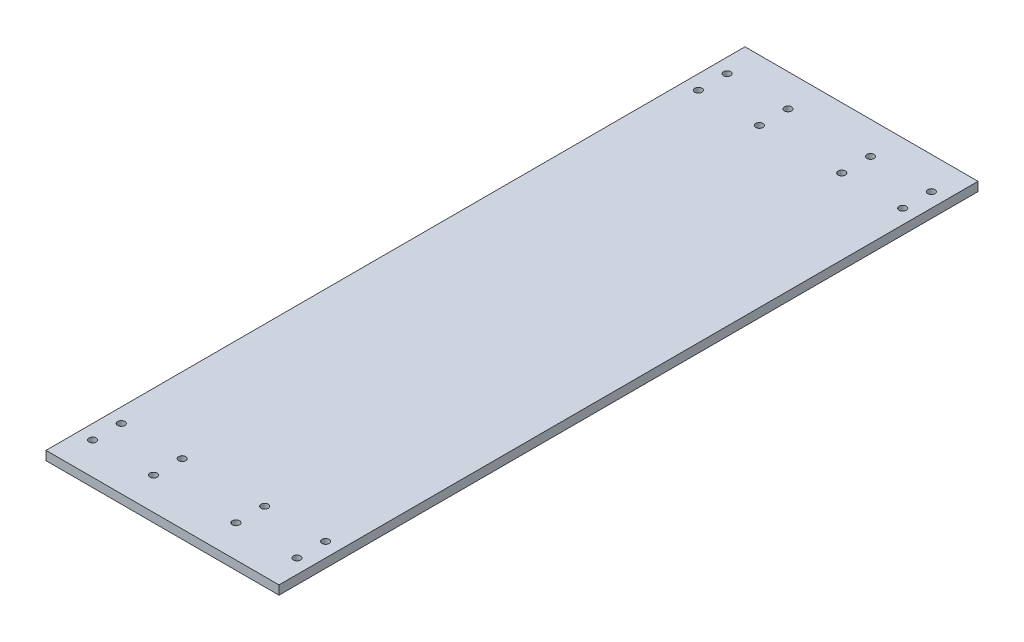
ISO-10303-21;
HEADER;
FILE_DESCRIPTION(('STEP AP214'),'2;1');
FILE_NAME('part.step','',(''),(''),'','','');
FILE_SCHEMA(('AUTOMOTIVE_DESIGN { 1 0 10303 214 1 1 1 1 }'));
ENDSEC;
DATA;
#1=APPLICATION_CONTEXT('core data for automotive mechanical design processes');
#2=APPLICATION_PROTOCOL_DEFINITION('international standard','automotive_design',2000,#1);
#3=PRODUCT_CONTEXT('',#1,'mechanical');
#4=PRODUCT('Part','Part','',(#3));
#5=PRODUCT_RELATED_PRODUCT_CATEGORY('part','',(#4));
#6=PRODUCT_DEFINITION_FORMATION('','',#4);
#7=PRODUCT_DEFINITION_CONTEXT('part definition',#1,'design');
#8=PRODUCT_DEFINITION('design','',#6,#7);
#9=PRODUCT_DEFINITION_SHAPE('','',#8);
#10=(LENGTH_UNIT() NAMED_UNIT(*) SI_UNIT(.MILLI.,.METRE.));
#11=(NAMED_UNIT(*) PLANE_ANGLE_UNIT() SI_UNIT($,.RADIAN.));
#12=(NAMED_UNIT(*) SI_UNIT($,.STERADIAN.) SOLID_ANGLE_UNIT());
#13=UNCERTAINTY_MEASURE_WITH_UNIT(LENGTH_MEASURE(1.E-05),#10,'distance_accuracy_value','');
#14=(GEOMETRIC_REPRESENTATION_CONTEXT(3) GLOBAL_UNCERTAINTY_ASSIGNED_CONTEXT((#13)) GLOBAL_UNIT_ASSIGNED_CONTEXT((#10,
#11,#12)) REPRESENTATION_CONTEXT('',''));
#15=CARTESIAN_POINT('',(0.,0.,0.));
#16=DIRECTION('',(0.,0.,1.));
#17=DIRECTION('',(1.,0.,0.));
#18=AXIS2_PLACEMENT_3D('',#15,#16,#17);
#19=CARTESIAN_POINT('',(65.,5.,195.));
#20=DIRECTION('',(-1.,0.,0.));
#21=DIRECTION('',(0.,0.,1.));
#22=AXIS2_PLACEMENT_3D('',#19,#20,#21);
#23=PLANE('',#22);
#24=DIRECTION('',(0.,0.,-1.));
#25=VECTOR('',#24,1.);
#26=CARTESIAN_POINT('',(65.,0.,195.));
#27=LINE('',#26,#25);
#28=CARTESIAN_POINT('',(65.,0.,195.));
#29=VERTEX_POINT('',#28);
#30=CARTESIAN_POINT('',(65.,0.,-195.));
#31=VERTEX_POINT('',#30);
#32=EDGE_CURVE('E99',#29,#31,#27,.T.);
#33=ORIENTED_EDGE('',*,*,#32,.T.);
#34=DIRECTION('',(0.,-1.,0.));
#35=VECTOR('',#34,1.);
#36=CARTESIAN_POINT('',(65.,5.,-195.));
#37=LINE('',#36,#35);
#38=CARTESIAN_POINT('',(65.,5.,-195.));
#39=VERTEX_POINT('',#38);
#40=EDGE_CURVE('E11',#39,#31,#37,.T.);
#41=ORIENTED_EDGE('',*,*,#40,.F.);
#42=DIRECTION('',(0.,0.,-1.));
#43=VECTOR('',#42,1.);
#44=CARTESIAN_POINT('',(65.,5.,195.));
#45=LINE('',#44,#43);
#46=CARTESIAN_POINT('',(65.,5.,195.));
#47=VERTEX_POINT('',#46);
#48=EDGE_CURVE('E86',#47,#39,#45,.T.);
#49=ORIENTED_EDGE('',*,*,#48,.F.);
#50=DIRECTION('',(0.,-1.,0.));
#51=VECTOR('',#50,1.);
#52=CARTESIAN_POINT('',(65.,5.,195.));
#53=LINE('',#52,#51);
#54=EDGE_CURVE('E95',#47,#29,#53,.T.);
#55=ORIENTED_EDGE('',*,*,#54,.T.);
#56=EDGE_LOOP('',(#33,#41,#49,#55));
#57=FACE_BOUND('',#56,.T.);
#58=ADVANCED_FACE('F33',(#57),#23,.F.);
#59=CARTESIAN_POINT('',(-65.,5.,-195.));
#60=DIRECTION('',(0.,0.,1.));
#61=DIRECTION('',(1.,0.,0.));
#62=AXIS2_PLACEMENT_3D('',#59,#60,#61);
#63=PLANE('',#62);
#64=DIRECTION('',(-1.,0.,0.));
#65=VECTOR('',#64,1.);
#66=CARTESIAN_POINT('',(-65.,0.,-195.));
#67=LINE('',#66,#65);
#68=CARTESIAN_POINT('',(-65.,0.,-195.));
#69=VERTEX_POINT('',#68);
#70=EDGE_CURVE('E90',#31,#69,#67,.T.);
#71=ORIENTED_EDGE('',*,*,#70,.T.);
#72=DIRECTION('',(0.,-1.,0.));
#73=VECTOR('',#72,1.);
#74=CARTESIAN_POINT('',(-65.,5.,-195.));
#75=LINE('',#74,#73);
#76=CARTESIAN_POINT('',(-65.,5.,-195.));
#77=VERTEX_POINT('',#76);
#78=EDGE_CURVE('E42',#77,#69,#75,.T.);
#79=ORIENTED_EDGE('',*,*,#78,.F.);
#80=DIRECTION('',(-1.,0.,0.));
#81=VECTOR('',#80,1.);
#82=CARTESIAN_POINT('',(-65.,5.,-195.));
#83=LINE('',#82,#81);
#84=EDGE_CURVE('E81',#39,#77,#83,.T.);
#85=ORIENTED_EDGE('',*,*,#84,.F.);
#86=ORIENTED_EDGE('',*,*,#40,.T.);
#87=EDGE_LOOP('',(#71,#79,#85,#86));
#88=FACE_BOUND('',#87,.T.);
#89=ADVANCED_FACE('F89',(#88),#63,.F.);
#90=CARTESIAN_POINT('',(-65.,5.,195.));
#91=DIRECTION('',(1.,0.,0.));
#92=DIRECTION('',(0.,0.,-1.));
#93=AXIS2_PLACEMENT_3D('',#90,#91,#92);
#94=PLANE('',#93);
#95=DIRECTION('',(0.,0.,1.));
#96=VECTOR('',#95,1.);
#97=CARTESIAN_POINT('',(-65.,0.,195.));
#98=LINE('',#97,#96);
#99=CARTESIAN_POINT('',(-65.,0.,195.));
#100=VERTEX_POINT('',#99);
#101=EDGE_CURVE('E68',#69,#100,#98,.T.);
#102=ORIENTED_EDGE('',*,*,#101,.T.);
#103=DIRECTION('',(0.,-1.,0.));
#104=VECTOR('',#103,1.);
#105=CARTESIAN_POINT('',(-65.,5.,195.));
#106=LINE('',#105,#104);
#107=CARTESIAN_POINT('',(-65.,5.,195.));
#108=VERTEX_POINT('',#107);
#109=EDGE_CURVE('E91',#108,#100,#106,.T.);
#110=ORIENTED_EDGE('',*,*,#109,.F.);
#111=DIRECTION('',(0.,0.,1.));
#112=VECTOR('',#111,1.);
#113=CARTESIAN_POINT('',(-65.,5.,195.));
#114=LINE('',#113,#112);
#115=EDGE_CURVE('E84',#77,#108,#114,.T.);
#116=ORIENTED_EDGE('',*,*,#115,.F.);
#117=ORIENTED_EDGE('',*,*,#78,.T.);
#118=EDGE_LOOP('',(#102,#110,#116,#117));
#119=FACE_BOUND('',#118,.T.);
#120=ADVANCED_FACE('F93',(#119),#94,.F.);
#121=CARTESIAN_POINT('',(-65.,5.,195.));
#122=DIRECTION('',(0.,0.,-1.));
#123=DIRECTION('',(-1.,0.,0.));
#124=AXIS2_PLACEMENT_3D('',#121,#122,#123);
#125=PLANE('',#124);
#126=DIRECTION('',(1.,0.,0.));
#127=VECTOR('',#126,1.);
#128=CARTESIAN_POINT('',(-65.,0.,195.));
#129=LINE('',#128,#127);
#130=EDGE_CURVE('E74',#100,#29,#129,.T.);
#131=ORIENTED_EDGE('',*,*,#130,.T.);
#132=ORIENTED_EDGE('',*,*,#54,.F.);
#133=DIRECTION('',(1.,0.,0.));
#134=VECTOR('',#133,1.);
#135=CARTESIAN_POINT('',(-65.,5.,195.));
#136=LINE('',#135,#134);
#137=EDGE_CURVE('E51',#108,#47,#136,.T.);
#138=ORIENTED_EDGE('',*,*,#137,.F.);
#139=ORIENTED_EDGE('',*,*,#109,.T.);
#140=EDGE_LOOP('',(#131,#132,#138,#139));
#141=FACE_BOUND('',#140,.T.);
#142=ADVANCED_FACE('F202',(#141),#125,.F.);
#143=CARTESIAN_POINT('',(0.,5.,0.));
#144=DIRECTION('',(0.,-1.,0.));
#145=DIRECTION('',(0.,0.,-1.));
#146=AXIS2_PLACEMENT_3D('',#143,#144,#145);
#147=PLANE('',#146);
#148=CARTESIAN_POINT('',(57.,5.,161.));
#149=DIRECTION('',(0.,1.,0.));
#150=DIRECTION('',(0.,0.,-1.));
#151=AXIS2_PLACEMENT_3D('',#148,#149,#150);
#152=CIRCLE('',#151,2.);
#153=CARTESIAN_POINT('',(57.,5.,159.));
#154=VERTEX_POINT('',#153);
#155=EDGE_CURVE('E404',#154,#154,#152,.T.);
#156=ORIENTED_EDGE('',*,*,#155,.F.);
#157=EDGE_LOOP('',(#156));
#158=FACE_BOUND('',#157,.T.);
#159=CARTESIAN_POINT('',(23.,5.,177.));
#160=DIRECTION('',(0.,1.,0.));
#161=DIRECTION('',(0.,0.,-1.));
#162=AXIS2_PLACEMENT_3D('',#159,#160,#161);
#163=CIRCLE('',#162,2.);
#164=CARTESIAN_POINT('',(23.,5.,175.));
#165=VERTEX_POINT('',#164);
#166=EDGE_CURVE('E405',#165,#165,#163,.T.);
#167=ORIENTED_EDGE('',*,*,#166,.F.);
#168=EDGE_LOOP('',(#167));
#169=FACE_BOUND('',#168,.T.);
#170=CARTESIAN_POINT('',(23.,5.,161.));
#171=DIRECTION('',(0.,1.,0.));
#172=DIRECTION('',(0.,0.,-1.));
#173=AXIS2_PLACEMENT_3D('',#170,#171,#172);
#174=CIRCLE('',#173,2.);
#175=CARTESIAN_POINT('',(23.,5.,159.));
#176=VERTEX_POINT('',#175);
#177=EDGE_CURVE('E409',#176,#176,#174,.T.);
#178=ORIENTED_EDGE('',*,*,#177,.F.);
#179=EDGE_LOOP('',(#178));
#180=FACE_BOUND('',#179,.T.);
#181=CARTESIAN_POINT('',(57.,5.,177.));
#182=DIRECTION('',(0.,1.,0.));
#183=DIRECTION('',(0.,0.,-1.));
#184=AXIS2_PLACEMENT_3D('',#181,#182,#183);
#185=CIRCLE('',#184,2.);
#186=CARTESIAN_POINT('',(57.,5.,175.));
#187=VERTEX_POINT('',#186);
#188=EDGE_CURVE('E152',#187,#187,#185,.T.);
#189=ORIENTED_EDGE('',*,*,#188,.F.);
#190=EDGE_LOOP('',(#189));
#191=FACE_BOUND('',#190,.T.);
#192=CARTESIAN_POINT('',(-57.,5.,161.));
#193=DIRECTION('',(0.,-1.,0.));
#194=DIRECTION('',(0.,0.,-1.));
#195=AXIS2_PLACEMENT_3D('',#192,#193,#194);
#196=CIRCLE('',#195,2.);
#197=CARTESIAN_POINT('',(-57.,5.,159.));
#198=VERTEX_POINT('',#197);
#199=EDGE_CURVE('E168',#198,#198,#196,.T.);
#200=ORIENTED_EDGE('',*,*,#199,.T.);
#201=EDGE_LOOP('',(#200));
#202=FACE_BOUND('',#201,.T.);
#203=CARTESIAN_POINT('',(-23.,5.,177.));
#204=DIRECTION('',(0.,-1.,0.));
#205=DIRECTION('',(0.,0.,-1.));
#206=AXIS2_PLACEMENT_3D('',#203,#204,#205);
#207=CIRCLE('',#206,2.);
#208=CARTESIAN_POINT('',(-23.,5.,175.));
#209=VERTEX_POINT('',#208);
#210=EDGE_CURVE('E163',#209,#209,#207,.T.);
#211=ORIENTED_EDGE('',*,*,#210,.T.);
#212=EDGE_LOOP('',(#211));
#213=FACE_BOUND('',#212,.T.);
#214=CARTESIAN_POINT('',(-23.,5.,161.));
#215=DIRECTION('',(0.,-1.,0.));
#216=DIRECTION('',(0.,0.,-1.));
#217=AXIS2_PLACEMENT_3D('',#214,#215,#216);
#218=CIRCLE('',#217,2.);
#219=CARTESIAN_POINT('',(-23.,5.,159.));
#220=VERTEX_POINT('',#219);
#221=EDGE_CURVE('E159',#220,#220,#218,.T.);
#222=ORIENTED_EDGE('',*,*,#221,.T.);
#223=EDGE_LOOP('',(#222));
#224=FACE_BOUND('',#223,.T.);
#225=CARTESIAN_POINT('',(-57.,5.,177.));
#226=DIRECTION('',(0.,-1.,0.));
#227=DIRECTION('',(0.,0.,-1.));
#228=AXIS2_PLACEMENT_3D('',#225,#226,#227);
#229=CIRCLE('',#228,2.);
#230=CARTESIAN_POINT('',(-57.,5.,175.));
#231=VERTEX_POINT('',#230);
#232=EDGE_CURVE('E138',#231,#231,#229,.T.);
#233=ORIENTED_EDGE('',*,*,#232,.T.);
#234=EDGE_LOOP('',(#233));
#235=FACE_BOUND('',#234,.T.);
#236=CARTESIAN_POINT('',(57.,5.,-161.));
#237=DIRECTION('',(0.,-1.,0.));
#238=DIRECTION('',(0.,0.,1.));
#239=AXIS2_PLACEMENT_3D('',#236,#237,#238);
#240=CIRCLE('',#239,2.);
#241=CARTESIAN_POINT('',(57.,5.,-159.));
#242=VERTEX_POINT('',#241);
#243=EDGE_CURVE('E180',#242,#242,#240,.T.);
#244=ORIENTED_EDGE('',*,*,#243,.T.);
#245=EDGE_LOOP('',(#244));
#246=FACE_BOUND('',#245,.T.);
#247=CARTESIAN_POINT('',(23.,5.,-177.));
#248=DIRECTION('',(0.,-1.,0.));
#249=DIRECTION('',(0.,0.,1.));
#250=AXIS2_PLACEMENT_3D('',#247,#248,#249);
#251=CIRCLE('',#250,2.);
#252=CARTESIAN_POINT('',(23.,5.,-175.));
#253=VERTEX_POINT('',#252);
#254=EDGE_CURVE('E179',#253,#253,#251,.T.);
#255=ORIENTED_EDGE('',*,*,#254,.T.);
#256=EDGE_LOOP('',(#255));
#257=FACE_BOUND('',#256,.T.);
#258=CARTESIAN_POINT('',(23.,5.,-161.));
#259=DIRECTION('',(0.,-1.,0.));
#260=DIRECTION('',(0.,0.,1.));
#261=AXIS2_PLACEMENT_3D('',#258,#259,#260);
#262=CIRCLE('',#261,2.);
#263=CARTESIAN_POINT('',(23.,5.,-159.));
#264=VERTEX_POINT('',#263);
#265=EDGE_CURVE('E147',#264,#264,#262,.T.);
#266=ORIENTED_EDGE('',*,*,#265,.T.);
#267=EDGE_LOOP('',(#266));
#268=FACE_BOUND('',#267,.T.);
#269=CARTESIAN_POINT('',(57.,5.,-177.));
#270=DIRECTION('',(0.,-1.,0.));
#271=DIRECTION('',(0.,0.,1.));
#272=AXIS2_PLACEMENT_3D('',#269,#270,#271);
#273=CIRCLE('',#272,2.);
#274=CARTESIAN_POINT('',(57.,5.,-175.));
#275=VERTEX_POINT('',#274);
#276=EDGE_CURVE('E124',#275,#275,#273,.T.);
#277=ORIENTED_EDGE('',*,*,#276,.T.);
#278=EDGE_LOOP('',(#277));
#279=FACE_BOUND('',#278,.T.);
#280=CARTESIAN_POINT('',(-57.,5.,-161.));
#281=DIRECTION('',(0.,1.,0.));
#282=DIRECTION('',(0.,0.,1.));
#283=AXIS2_PLACEMENT_3D('',#280,#281,#282);
#284=CIRCLE('',#283,2.);
#285=CARTESIAN_POINT('',(-57.,5.,-159.));
#286=VERTEX_POINT('',#285);
#287=EDGE_CURVE('E190',#286,#286,#284,.T.);
#288=ORIENTED_EDGE('',*,*,#287,.F.);
#289=EDGE_LOOP('',(#288));
#290=FACE_BOUND('',#289,.T.);
#291=CARTESIAN_POINT('',(-23.,5.,-177.));
#292=DIRECTION('',(0.,1.,0.));
#293=DIRECTION('',(0.,0.,1.));
#294=AXIS2_PLACEMENT_3D('',#291,#292,#293);
#295=CIRCLE('',#294,2.);
#296=CARTESIAN_POINT('',(-23.,5.,-175.));
#297=VERTEX_POINT('',#296);
#298=EDGE_CURVE('E189',#297,#297,#295,.T.);
#299=ORIENTED_EDGE('',*,*,#298,.F.);
#300=EDGE_LOOP('',(#299));
#301=FACE_BOUND('',#300,.T.);
#302=CARTESIAN_POINT('',(-23.,5.,-161.));
#303=DIRECTION('',(0.,1.,0.));
#304=DIRECTION('',(0.,0.,1.));
#305=AXIS2_PLACEMENT_3D('',#302,#303,#304);
#306=CIRCLE('',#305,2.);
#307=CARTESIAN_POINT('',(-23.,5.,-159.));
#308=VERTEX_POINT('',#307);
#309=EDGE_CURVE('E133',#308,#308,#306,.T.);
#310=ORIENTED_EDGE('',*,*,#309,.F.);
#311=EDGE_LOOP('',(#310));
#312=FACE_BOUND('',#311,.T.);
#313=CARTESIAN_POINT('',(-57.,5.,-177.));
#314=DIRECTION('',(0.,1.,0.));
#315=DIRECTION('',(0.,0.,1.));
#316=AXIS2_PLACEMENT_3D('',#313,#314,#315);
#317=CIRCLE('',#316,2.);
#318=CARTESIAN_POINT('',(-57.,5.,-175.));
#319=VERTEX_POINT('',#318);
#320=EDGE_CURVE('E112',#319,#319,#317,.T.);
#321=ORIENTED_EDGE('',*,*,#320,.F.);
#322=EDGE_LOOP('',(#321));
#323=FACE_BOUND('',#322,.T.);
#324=ORIENTED_EDGE('',*,*,#48,.T.);
#325=ORIENTED_EDGE('',*,*,#84,.T.);
#326=ORIENTED_EDGE('',*,*,#115,.T.);
#327=ORIENTED_EDGE('',*,*,#137,.T.);
#328=EDGE_LOOP('',(#324,#325,#326,#327));
#329=FACE_BOUND('',#328,.T.);
#330=ADVANCED_FACE('F82',(#158,#169,#180,#191,#202,#213,#224,#235,#246,#257,#268,#279,#290,#301,
#312,#323,#329),#147,.F.);
#331=CARTESIAN_POINT('',(0.,0.,0.));
#332=DIRECTION('',(0.,-1.,0.));
#333=DIRECTION('',(0.,0.,-1.));
#334=AXIS2_PLACEMENT_3D('',#331,#332,#333);
#335=PLANE('',#334);
#336=CARTESIAN_POINT('',(57.,0.,161.));
#337=DIRECTION('',(0.,-1.,0.));
#338=DIRECTION('',(0.,0.,-1.));
#339=AXIS2_PLACEMENT_3D('',#336,#337,#338);
#340=CIRCLE('',#339,2.);
#341=CARTESIAN_POINT('',(57.,0.,159.));
#342=VERTEX_POINT('',#341);
#343=EDGE_CURVE('E36',#342,#342,#340,.T.);
#344=ORIENTED_EDGE('',*,*,#343,.F.);
#345=EDGE_LOOP('',(#344));
#346=FACE_BOUND('',#345,.T.);
#347=CARTESIAN_POINT('',(23.,0.,177.));
#348=DIRECTION('',(0.,-1.,0.));
#349=DIRECTION('',(0.,0.,-1.));
#350=AXIS2_PLACEMENT_3D('',#347,#348,#349);
#351=CIRCLE('',#350,2.);
#352=CARTESIAN_POINT('',(23.,0.,175.));
#353=VERTEX_POINT('',#352);
#354=EDGE_CURVE('E154',#353,#353,#351,.T.);
#355=ORIENTED_EDGE('',*,*,#354,.F.);
#356=EDGE_LOOP('',(#355));
#357=FACE_BOUND('',#356,.T.);
#358=CARTESIAN_POINT('',(23.,0.,161.));
#359=DIRECTION('',(0.,-1.,0.));
#360=DIRECTION('',(0.,0.,-1.));
#361=AXIS2_PLACEMENT_3D('',#358,#359,#360);
#362=CIRCLE('',#361,2.);
#363=CARTESIAN_POINT('',(23.,0.,159.));
#364=VERTEX_POINT('',#363);
#365=EDGE_CURVE('E151',#364,#364,#362,.T.);
#366=ORIENTED_EDGE('',*,*,#365,.F.);
#367=EDGE_LOOP('',(#366));
#368=FACE_BOUND('',#367,.T.);
#369=CARTESIAN_POINT('',(57.,0.,177.));
#370=DIRECTION('',(0.,-1.,0.));
#371=DIRECTION('',(0.,0.,-1.));
#372=AXIS2_PLACEMENT_3D('',#369,#370,#371);
#373=CIRCLE('',#372,2.);
#374=CARTESIAN_POINT('',(57.,0.,175.));
#375=VERTEX_POINT('',#374);
#376=EDGE_CURVE('E148',#375,#375,#373,.T.);
#377=ORIENTED_EDGE('',*,*,#376,.F.);
#378=EDGE_LOOP('',(#377));
#379=FACE_BOUND('',#378,.T.);
#380=CARTESIAN_POINT('',(-57.,0.,161.));
#381=DIRECTION('',(0.,-1.,0.));
#382=DIRECTION('',(0.,0.,-1.));
#383=AXIS2_PLACEMENT_3D('',#380,#381,#382);
#384=CIRCLE('',#383,2.);
#385=CARTESIAN_POINT('',(-57.,0.,159.));
#386=VERTEX_POINT('',#385);
#387=EDGE_CURVE('E144',#386,#386,#384,.F.);
#388=ORIENTED_EDGE('',*,*,#387,.T.);
#389=EDGE_LOOP('',(#388));
#390=FACE_BOUND('',#389,.T.);
#391=CARTESIAN_POINT('',(-23.,0.,177.));
#392=DIRECTION('',(0.,-1.,0.));
#393=DIRECTION('',(0.,0.,-1.));
#394=AXIS2_PLACEMENT_3D('',#391,#392,#393);
#395=CIRCLE('',#394,2.);
#396=CARTESIAN_POINT('',(-23.,0.,175.));
#397=VERTEX_POINT('',#396);
#398=EDGE_CURVE('E141',#397,#397,#395,.F.);
#399=ORIENTED_EDGE('',*,*,#398,.T.);
#400=EDGE_LOOP('',(#399));
#401=FACE_BOUND('',#400,.T.);
#402=CARTESIAN_POINT('',(-23.,0.,161.));
#403=DIRECTION('',(0.,-1.,0.));
#404=DIRECTION('',(0.,0.,-1.));
#405=AXIS2_PLACEMENT_3D('',#402,#403,#404);
#406=CIRCLE('',#405,2.);
#407=CARTESIAN_POINT('',(-23.,0.,159.));
#408=VERTEX_POINT('',#407);
#409=EDGE_CURVE('E137',#408,#408,#406,.F.);
#410=ORIENTED_EDGE('',*,*,#409,.T.);
#411=EDGE_LOOP('',(#410));
#412=FACE_BOUND('',#411,.T.);
#413=CARTESIAN_POINT('',(-57.,0.,177.));
#414=DIRECTION('',(0.,-1.,0.));
#415=DIRECTION('',(0.,0.,-1.));
#416=AXIS2_PLACEMENT_3D('',#413,#414,#415);
#417=CIRCLE('',#416,2.);
#418=CARTESIAN_POINT('',(-57.,0.,175.));
#419=VERTEX_POINT('',#418);
#420=EDGE_CURVE('E134',#419,#419,#417,.F.);
#421=ORIENTED_EDGE('',*,*,#420,.T.);
#422=EDGE_LOOP('',(#421));
#423=FACE_BOUND('',#422,.T.);
#424=CARTESIAN_POINT('',(57.,0.,-161.));
#425=DIRECTION('',(0.,-1.,0.));
#426=DIRECTION('',(0.,0.,-1.));
#427=AXIS2_PLACEMENT_3D('',#424,#425,#426);
#428=CIRCLE('',#427,2.);
#429=CARTESIAN_POINT('',(57.,0.,-163.));
#430=VERTEX_POINT('',#429);
#431=EDGE_CURVE('E130',#430,#430,#428,.F.);
#432=ORIENTED_EDGE('',*,*,#431,.T.);
#433=EDGE_LOOP('',(#432));
#434=FACE_BOUND('',#433,.T.);
#435=CARTESIAN_POINT('',(23.,0.,-177.));
#436=DIRECTION('',(0.,-1.,0.));
#437=DIRECTION('',(0.,0.,-1.));
#438=AXIS2_PLACEMENT_3D('',#435,#436,#437);
#439=CIRCLE('',#438,2.);
#440=CARTESIAN_POINT('',(23.,0.,-179.));
#441=VERTEX_POINT('',#440);
#442=EDGE_CURVE('E127',#441,#441,#439,.F.);
#443=ORIENTED_EDGE('',*,*,#442,.T.);
#444=EDGE_LOOP('',(#443));
#445=FACE_BOUND('',#444,.T.);
#446=CARTESIAN_POINT('',(23.,0.,-161.));
#447=DIRECTION('',(0.,-1.,0.));
#448=DIRECTION('',(0.,0.,-1.));
#449=AXIS2_PLACEMENT_3D('',#446,#447,#448);
#450=CIRCLE('',#449,2.);
#451=CARTESIAN_POINT('',(23.,0.,-163.));
#452=VERTEX_POINT('',#451);
#453=EDGE_CURVE('E123',#452,#452,#450,.F.);
#454=ORIENTED_EDGE('',*,*,#453,.T.);
#455=EDGE_LOOP('',(#454));
#456=FACE_BOUND('',#455,.T.);
#457=CARTESIAN_POINT('',(57.,0.,-177.));
#458=DIRECTION('',(0.,-1.,0.));
#459=DIRECTION('',(0.,0.,-1.));
#460=AXIS2_PLACEMENT_3D('',#457,#458,#459);
#461=CIRCLE('',#460,2.);
#462=CARTESIAN_POINT('',(57.,0.,-179.));
#463=VERTEX_POINT('',#462);
#464=EDGE_CURVE('E120',#463,#463,#461,.F.);
#465=ORIENTED_EDGE('',*,*,#464,.T.);
#466=EDGE_LOOP('',(#465));
#467=FACE_BOUND('',#466,.T.);
#468=CARTESIAN_POINT('',(-57.,0.,-161.));
#469=DIRECTION('',(0.,-1.,0.));
#470=DIRECTION('',(0.,0.,-1.));
#471=AXIS2_PLACEMENT_3D('',#468,#469,#470);
#472=CIRCLE('',#471,2.);
#473=CARTESIAN_POINT('',(-57.,0.,-163.));
#474=VERTEX_POINT('',#473);
#475=EDGE_CURVE('E102',#474,#474,#472,.T.);
#476=ORIENTED_EDGE('',*,*,#475,.F.);
#477=EDGE_LOOP('',(#476));
#478=FACE_BOUND('',#477,.T.);
#479=CARTESIAN_POINT('',(-23.,0.,-177.));
#480=DIRECTION('',(0.,-1.,0.));
#481=DIRECTION('',(0.,0.,-1.));
#482=AXIS2_PLACEMENT_3D('',#479,#480,#481);
#483=CIRCLE('',#482,2.);
#484=CARTESIAN_POINT('',(-23.,0.,-179.));
#485=VERTEX_POINT('',#484);
#486=EDGE_CURVE('E115',#485,#485,#483,.T.);
#487=ORIENTED_EDGE('',*,*,#486,.F.);
#488=EDGE_LOOP('',(#487));
#489=FACE_BOUND('',#488,.T.);
#490=CARTESIAN_POINT('',(-23.,0.,-161.));
#491=DIRECTION('',(0.,-1.,0.));
#492=DIRECTION('',(0.,0.,-1.));
#493=AXIS2_PLACEMENT_3D('',#490,#491,#492);
#494=CIRCLE('',#493,2.);
#495=CARTESIAN_POINT('',(-23.,0.,-163.));
#496=VERTEX_POINT('',#495);
#497=EDGE_CURVE('E111',#496,#496,#494,.T.);
#498=ORIENTED_EDGE('',*,*,#497,.F.);
#499=EDGE_LOOP('',(#498));
#500=FACE_BOUND('',#499,.T.);
#501=CARTESIAN_POINT('',(-57.,0.,-177.));
#502=DIRECTION('',(0.,-1.,0.));
#503=DIRECTION('',(0.,0.,-1.));
#504=AXIS2_PLACEMENT_3D('',#501,#502,#503);
#505=CIRCLE('',#504,2.);
#506=CARTESIAN_POINT('',(-57.,0.,-179.));
#507=VERTEX_POINT('',#506);
#508=EDGE_CURVE('E108',#507,#507,#505,.T.);
#509=ORIENTED_EDGE('',*,*,#508,.F.);
#510=EDGE_LOOP('',(#509));
#511=FACE_BOUND('',#510,.T.);
#512=ORIENTED_EDGE('',*,*,#32,.F.);
#513=ORIENTED_EDGE('',*,*,#130,.F.);
#514=ORIENTED_EDGE('',*,*,#101,.F.);
#515=ORIENTED_EDGE('',*,*,#70,.F.);
#516=EDGE_LOOP('',(#512,#513,#514,#515));
#517=FACE_BOUND('',#516,.T.);
#518=ADVANCED_FACE('F201',(#346,#357,#368,#379,#390,#401,#412,#423,#434,#445,#456,#467,#478,
#489,#500,#511,#517),#335,.T.);
#519=CARTESIAN_POINT('',(-57.,-5.,-177.));
#520=DIRECTION('',(0.,1.,0.));
#521=DIRECTION('',(0.,0.,1.));
#522=AXIS2_PLACEMENT_3D('',#519,#520,#521);
#523=CYLINDRICAL_SURFACE('',#522,2.);
#524=ORIENTED_EDGE('',*,*,#508,.T.);
#525=EDGE_LOOP('',(#524));
#526=FACE_BOUND('',#525,.T.);
#527=ORIENTED_EDGE('',*,*,#320,.T.);
#528=EDGE_LOOP('',(#527));
#529=FACE_BOUND('',#528,.T.);
#530=ADVANCED_FACE('F198',(#526,#529),#523,.F.);
#531=CARTESIAN_POINT('',(-23.,-5.,-161.));
#532=DIRECTION('',(0.,1.,0.));
#533=DIRECTION('',(0.,0.,1.));
#534=AXIS2_PLACEMENT_3D('',#531,#532,#533);
#535=CYLINDRICAL_SURFACE('',#534,2.);
#536=ORIENTED_EDGE('',*,*,#497,.T.);
#537=EDGE_LOOP('',(#536));
#538=FACE_BOUND('',#537,.T.);
#539=ORIENTED_EDGE('',*,*,#309,.T.);
#540=EDGE_LOOP('',(#539));
#541=FACE_BOUND('',#540,.T.);
#542=ADVANCED_FACE('F242',(#538,#541),#535,.F.);
#543=CARTESIAN_POINT('',(-23.,-5.,-177.));
#544=DIRECTION('',(0.,1.,0.));
#545=DIRECTION('',(0.,0.,1.));
#546=AXIS2_PLACEMENT_3D('',#543,#544,#545);
#547=CYLINDRICAL_SURFACE('',#546,2.);
#548=ORIENTED_EDGE('',*,*,#486,.T.);
#549=EDGE_LOOP('',(#548));
#550=FACE_BOUND('',#549,.T.);
#551=ORIENTED_EDGE('',*,*,#298,.T.);
#552=EDGE_LOOP('',(#551));
#553=FACE_BOUND('',#552,.T.);
#554=ADVANCED_FACE('F252',(#550,#553),#547,.F.);
#555=CARTESIAN_POINT('',(-57.,-5.,-161.));
#556=DIRECTION('',(0.,1.,0.));
#557=DIRECTION('',(0.,0.,1.));
#558=AXIS2_PLACEMENT_3D('',#555,#556,#557);
#559=CYLINDRICAL_SURFACE('',#558,2.);
#560=ORIENTED_EDGE('',*,*,#475,.T.);
#561=EDGE_LOOP('',(#560));
#562=FACE_BOUND('',#561,.T.);
#563=ORIENTED_EDGE('',*,*,#287,.T.);
#564=EDGE_LOOP('',(#563));
#565=FACE_BOUND('',#564,.T.);
#566=ADVANCED_FACE('F262',(#562,#565),#559,.F.);
#567=CARTESIAN_POINT('',(57.,-5.,-177.));
#568=DIRECTION('',(0.,1.,0.));
#569=DIRECTION('',(0.,0.,1.));
#570=AXIS2_PLACEMENT_3D('',#567,#568,#569);
#571=CYLINDRICAL_SURFACE('',#570,2.);
#572=ORIENTED_EDGE('',*,*,#464,.F.);
#573=EDGE_LOOP('',(#572));
#574=FACE_BOUND('',#573,.T.);
#575=ORIENTED_EDGE('',*,*,#276,.F.);
#576=EDGE_LOOP('',(#575));
#577=FACE_BOUND('',#576,.T.);
#578=ADVANCED_FACE('F271',(#574,#577),#571,.F.);
#579=CARTESIAN_POINT('',(23.,-5.,-161.));
#580=DIRECTION('',(0.,1.,0.));
#581=DIRECTION('',(0.,0.,1.));
#582=AXIS2_PLACEMENT_3D('',#579,#580,#581);
#583=CYLINDRICAL_SURFACE('',#582,2.);
#584=ORIENTED_EDGE('',*,*,#453,.F.);
#585=EDGE_LOOP('',(#584));
#586=FACE_BOUND('',#585,.T.);
#587=ORIENTED_EDGE('',*,*,#265,.F.);
#588=EDGE_LOOP('',(#587));
#589=FACE_BOUND('',#588,.T.);
#590=ADVANCED_FACE('F290',(#586,#589),#583,.F.);
#591=CARTESIAN_POINT('',(23.,-5.,-177.));
#592=DIRECTION('',(0.,1.,0.));
#593=DIRECTION('',(0.,0.,1.));
#594=AXIS2_PLACEMENT_3D('',#591,#592,#593);
#595=CYLINDRICAL_SURFACE('',#594,2.);
#596=ORIENTED_EDGE('',*,*,#442,.F.);
#597=EDGE_LOOP('',(#596));
#598=FACE_BOUND('',#597,.T.);
#599=ORIENTED_EDGE('',*,*,#254,.F.);
#600=EDGE_LOOP('',(#599));
#601=FACE_BOUND('',#600,.T.);
#602=ADVANCED_FACE('F300',(#598,#601),#595,.F.);
#603=CARTESIAN_POINT('',(57.,-5.,-161.));
#604=DIRECTION('',(0.,1.,0.));
#605=DIRECTION('',(0.,0.,1.));
#606=AXIS2_PLACEMENT_3D('',#603,#604,#605);
#607=CYLINDRICAL_SURFACE('',#606,2.);
#608=ORIENTED_EDGE('',*,*,#431,.F.);
#609=EDGE_LOOP('',(#608));
#610=FACE_BOUND('',#609,.T.);
#611=ORIENTED_EDGE('',*,*,#243,.F.);
#612=EDGE_LOOP('',(#611));
#613=FACE_BOUND('',#612,.T.);
#614=ADVANCED_FACE('F310',(#610,#613),#607,.F.);
#615=CARTESIAN_POINT('',(-57.,-5.,177.));
#616=DIRECTION('',(0.,1.,0.));
#617=DIRECTION('',(0.,0.,1.));
#618=AXIS2_PLACEMENT_3D('',#615,#616,#617);
#619=CYLINDRICAL_SURFACE('',#618,2.);
#620=ORIENTED_EDGE('',*,*,#420,.F.);
#621=EDGE_LOOP('',(#620));
#622=FACE_BOUND('',#621,.T.);
#623=ORIENTED_EDGE('',*,*,#232,.F.);
#624=EDGE_LOOP('',(#623));
#625=FACE_BOUND('',#624,.T.);
#626=ADVANCED_FACE('F320',(#622,#625),#619,.F.);
#627=CARTESIAN_POINT('',(-23.,-5.,161.));
#628=DIRECTION('',(0.,1.,0.));
#629=DIRECTION('',(0.,0.,1.));
#630=AXIS2_PLACEMENT_3D('',#627,#628,#629);
#631=CYLINDRICAL_SURFACE('',#630,2.);
#632=ORIENTED_EDGE('',*,*,#409,.F.);
#633=EDGE_LOOP('',(#632));
#634=FACE_BOUND('',#633,.T.);
#635=ORIENTED_EDGE('',*,*,#221,.F.);
#636=EDGE_LOOP('',(#635));
#637=FACE_BOUND('',#636,.T.);
#638=ADVANCED_FACE('F330',(#634,#637),#631,.F.);
#639=CARTESIAN_POINT('',(-23.,-5.,177.));
#640=DIRECTION('',(0.,1.,0.));
#641=DIRECTION('',(0.,0.,1.));
#642=AXIS2_PLACEMENT_3D('',#639,#640,#641);
#643=CYLINDRICAL_SURFACE('',#642,2.);
#644=ORIENTED_EDGE('',*,*,#398,.F.);
#645=EDGE_LOOP('',(#644));
#646=FACE_BOUND('',#645,.T.);
#647=ORIENTED_EDGE('',*,*,#210,.F.);
#648=EDGE_LOOP('',(#647));
#649=FACE_BOUND('',#648,.T.);
#650=ADVANCED_FACE('F340',(#646,#649),#643,.F.);
#651=CARTESIAN_POINT('',(-57.,-5.,161.));
#652=DIRECTION('',(0.,1.,0.));
#653=DIRECTION('',(0.,0.,1.));
#654=AXIS2_PLACEMENT_3D('',#651,#652,#653);
#655=CYLINDRICAL_SURFACE('',#654,2.);
#656=ORIENTED_EDGE('',*,*,#387,.F.);
#657=EDGE_LOOP('',(#656));
#658=FACE_BOUND('',#657,.T.);
#659=ORIENTED_EDGE('',*,*,#199,.F.);
#660=EDGE_LOOP('',(#659));
#661=FACE_BOUND('',#660,.T.);
#662=ADVANCED_FACE('F350',(#658,#661),#655,.F.);
#663=CARTESIAN_POINT('',(57.,-5.,177.));
#664=DIRECTION('',(0.,1.,0.));
#665=DIRECTION('',(0.,0.,1.));
#666=AXIS2_PLACEMENT_3D('',#663,#664,#665);
#667=CYLINDRICAL_SURFACE('',#666,2.);
#668=ORIENTED_EDGE('',*,*,#376,.T.);
#669=EDGE_LOOP('',(#668));
#670=FACE_BOUND('',#669,.T.);
#671=ORIENTED_EDGE('',*,*,#188,.T.);
#672=EDGE_LOOP('',(#671));
#673=FACE_BOUND('',#672,.T.);
#674=ADVANCED_FACE('F360',(#670,#673),#667,.F.);
#675=CARTESIAN_POINT('',(23.,-5.,161.));
#676=DIRECTION('',(0.,1.,0.));
#677=DIRECTION('',(0.,0.,1.));
#678=AXIS2_PLACEMENT_3D('',#675,#676,#677);
#679=CYLINDRICAL_SURFACE('',#678,2.);
#680=ORIENTED_EDGE('',*,*,#365,.T.);
#681=EDGE_LOOP('',(#680));
#682=FACE_BOUND('',#681,.T.);
#683=ORIENTED_EDGE('',*,*,#177,.T.);
#684=EDGE_LOOP('',(#683));
#685=FACE_BOUND('',#684,.T.);
#686=ADVANCED_FACE('F370',(#682,#685),#679,.F.);
#687=CARTESIAN_POINT('',(23.,-5.,177.));
#688=DIRECTION('',(0.,1.,0.));
#689=DIRECTION('',(0.,0.,1.));
#690=AXIS2_PLACEMENT_3D('',#687,#688,#689);
#691=CYLINDRICAL_SURFACE('',#690,2.);
#692=ORIENTED_EDGE('',*,*,#354,.T.);
#693=EDGE_LOOP('',(#692));
#694=FACE_BOUND('',#693,.T.);
#695=ORIENTED_EDGE('',*,*,#166,.T.);
#696=EDGE_LOOP('',(#695));
#697=FACE_BOUND('',#696,.T.);
#698=ADVANCED_FACE('F380',(#694,#697),#691,.F.);
#699=CARTESIAN_POINT('',(57.,-5.,161.));
#700=DIRECTION('',(0.,1.,0.));
#701=DIRECTION('',(0.,0.,1.));
#702=AXIS2_PLACEMENT_3D('',#699,#700,#701);
#703=CYLINDRICAL_SURFACE('',#702,2.);
#704=ORIENTED_EDGE('',*,*,#343,.T.);
#705=EDGE_LOOP('',(#704));
#706=FACE_BOUND('',#705,.T.);
#707=ORIENTED_EDGE('',*,*,#155,.T.);
#708=EDGE_LOOP('',(#707));
#709=FACE_BOUND('',#708,.T.);
#710=ADVANCED_FACE('F390',(#706,#709),#703,.F.);
#711=CLOSED_SHELL('',(#58,#89,#120,#142,#330,#518,#530,#542,#554,#566,#578,#590,#602,#614,#626,
#638,#650,#662,#674,#686,#698,#710));
#712=MANIFOLD_SOLID_BREP('B2',#711);
#713=ADVANCED_BREP_SHAPE_REPRESENTATION('',(#18,#712),#14);
#714=SHAPE_DEFINITION_REPRESENTATION(#9,#713);
ENDSEC;
END-ISO-10303-21;
